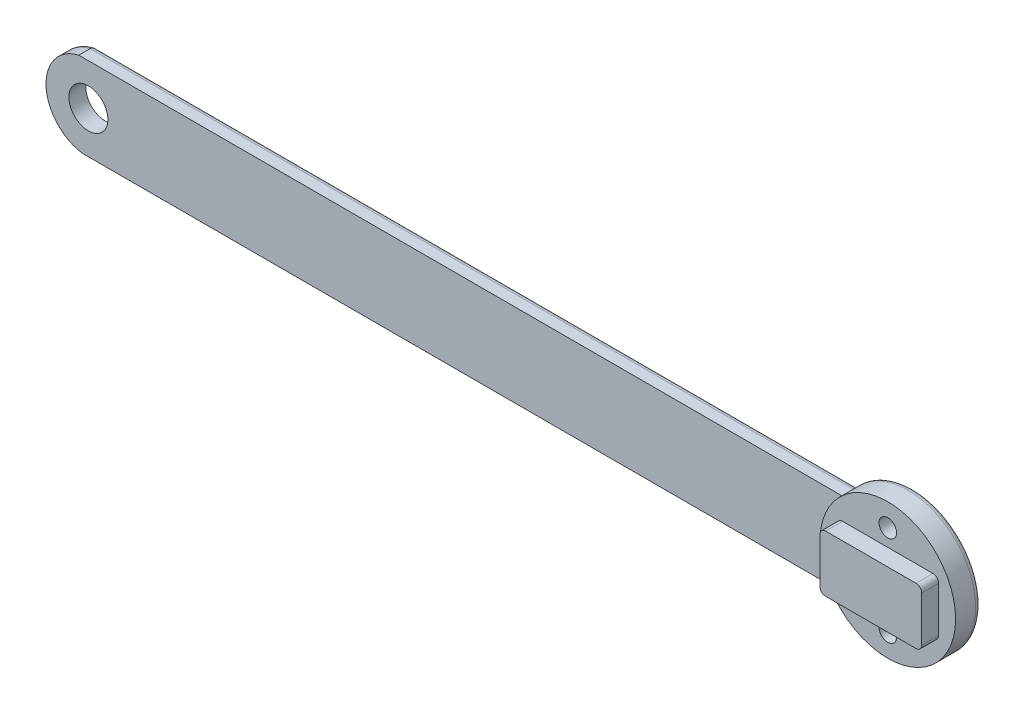
ISO-10303-21;
HEADER;
FILE_DESCRIPTION(('STEP AP214'),'2;1');
FILE_NAME('part.step','',(''),(''),'','','');
FILE_SCHEMA(('AUTOMOTIVE_DESIGN { 1 0 10303 214 1 1 1 1 }'));
ENDSEC;
DATA;
#1=APPLICATION_CONTEXT('core data for automotive mechanical design processes');
#2=APPLICATION_PROTOCOL_DEFINITION('international standard','automotive_design',2000,#1);
#3=PRODUCT_CONTEXT('',#1,'mechanical');
#4=PRODUCT('Part','Part','',(#3));
#5=PRODUCT_RELATED_PRODUCT_CATEGORY('part','',(#4));
#6=PRODUCT_DEFINITION_FORMATION('','',#4);
#7=PRODUCT_DEFINITION_CONTEXT('part definition',#1,'design');
#8=PRODUCT_DEFINITION('design','',#6,#7);
#9=PRODUCT_DEFINITION_SHAPE('','',#8);
#10=(LENGTH_UNIT() NAMED_UNIT(*) SI_UNIT(.MILLI.,.METRE.));
#11=(NAMED_UNIT(*) PLANE_ANGLE_UNIT() SI_UNIT($,.RADIAN.));
#12=(NAMED_UNIT(*) SI_UNIT($,.STERADIAN.) SOLID_ANGLE_UNIT());
#13=UNCERTAINTY_MEASURE_WITH_UNIT(LENGTH_MEASURE(1.E-05),#10,'distance_accuracy_value','');
#14=(GEOMETRIC_REPRESENTATION_CONTEXT(3) GLOBAL_UNCERTAINTY_ASSIGNED_CONTEXT((#13)) GLOBAL_UNIT_ASSIGNED_CONTEXT((#10,
#11,#12)) REPRESENTATION_CONTEXT('',''));
#15=CARTESIAN_POINT('',(0.,0.,0.));
#16=DIRECTION('',(0.,0.,1.));
#17=DIRECTION('',(1.,0.,0.));
#18=AXIS2_PLACEMENT_3D('',#15,#16,#17);
#19=CARTESIAN_POINT('',(0.,0.,3.));
#20=DIRECTION('',(0.,0.,1.));
#21=DIRECTION('',(1.,0.,0.));
#22=AXIS2_PLACEMENT_3D('',#19,#20,#21);
#23=PLANE('',#22);
#24=CARTESIAN_POINT('',(143.,0.,3.));
#25=DIRECTION('',(0.,0.,1.));
#26=DIRECTION('',(1.,0.,0.));
#27=AXIS2_PLACEMENT_3D('',#24,#25,#26);
#28=CIRCLE('',#27,12.);
#29=CARTESIAN_POINT('',(133.479823335982,7.30521979723319,3.));
#30=VERTEX_POINT('',#29);
#31=CARTESIAN_POINT('',(133.568113945347,-7.41886281393917,3.));
#32=VERTEX_POINT('',#31);
#33=EDGE_CURVE('E171',#30,#32,#28,.T.);
#34=ORIENTED_EDGE('',*,*,#33,.F.);
#35=DIRECTION('',(-1.,0.,0.));
#36=VECTOR('',#35,1.);
#37=CARTESIAN_POINT('',(-1.69816480770045,7.30521979723319,3.));
#38=LINE('',#37,#36);
#39=CARTESIAN_POINT('',(-1.69816480770045,7.30521979723319,3.));
#40=VERTEX_POINT('',#39);
#41=EDGE_CURVE('E200',#30,#40,#38,.T.);
#42=ORIENTED_EDGE('',*,*,#41,.T.);
#43=CARTESIAN_POINT('',(0.,0.,3.));
#44=DIRECTION('',(0.,0.,1.));
#45=DIRECTION('',(1.,0.,0.));
#46=AXIS2_PLACEMENT_3D('',#43,#44,#45);
#47=CIRCLE('',#46,7.5);
#48=CARTESIAN_POINT('',(-1.10021568246889,-7.41886281393917,3.));
#49=VERTEX_POINT('',#48);
#50=EDGE_CURVE('E190',#40,#49,#47,.T.);
#51=ORIENTED_EDGE('',*,*,#50,.T.);
#52=DIRECTION('',(1.,0.,0.));
#53=VECTOR('',#52,1.);
#54=CARTESIAN_POINT('',(-1.10021568246889,-7.41886281393917,3.));
#55=LINE('',#54,#53);
#56=EDGE_CURVE('E197',#49,#32,#55,.T.);
#57=ORIENTED_EDGE('',*,*,#56,.T.);
#58=EDGE_LOOP('',(#34,#42,#51,#57));
#59=FACE_BOUND('',#58,.T.);
#60=CARTESIAN_POINT('',(0.,0.,3.));
#61=DIRECTION('',(0.,0.,1.));
#62=DIRECTION('',(1.,0.,0.));
#63=AXIS2_PLACEMENT_3D('',#60,#61,#62);
#64=CIRCLE('',#63,3.45);
#65=CARTESIAN_POINT('',(3.45,0.,3.));
#66=VERTEX_POINT('',#65);
#67=EDGE_CURVE('E186',#66,#66,#64,.T.);
#68=ORIENTED_EDGE('',*,*,#67,.F.);
#69=EDGE_LOOP('',(#68));
#70=FACE_BOUND('',#69,.T.);
#71=ADVANCED_FACE('F38',(#59,#70),#23,.T.);
#72=CARTESIAN_POINT('',(0.,0.,0.));
#73=DIRECTION('',(0.,0.,1.));
#74=DIRECTION('',(1.,0.,0.));
#75=AXIS2_PLACEMENT_3D('',#72,#73,#74);
#76=PLANE('',#75);
#77=CARTESIAN_POINT('',(143.,-8.,0.));
#78=DIRECTION('',(0.,0.,1.));
#79=DIRECTION('',(1.,0.,0.));
#80=AXIS2_PLACEMENT_3D('',#77,#78,#79);
#81=CIRCLE('',#80,1.79999999999999);
#82=CARTESIAN_POINT('',(144.8,-8.,0.));
#83=VERTEX_POINT('',#82);
#84=EDGE_CURVE('E292',#83,#83,#81,.T.);
#85=ORIENTED_EDGE('',*,*,#84,.T.);
#86=EDGE_LOOP('',(#85));
#87=FACE_BOUND('',#86,.T.);
#88=CARTESIAN_POINT('',(143.,8.,0.));
#89=DIRECTION('',(0.,0.,1.));
#90=DIRECTION('',(1.,0.,0.));
#91=AXIS2_PLACEMENT_3D('',#88,#89,#90);
#92=CIRCLE('',#91,1.79999999999999);
#93=CARTESIAN_POINT('',(144.8,8.,0.));
#94=VERTEX_POINT('',#93);
#95=EDGE_CURVE('E240',#94,#94,#92,.T.);
#96=ORIENTED_EDGE('',*,*,#95,.T.);
#97=EDGE_LOOP('',(#96));
#98=FACE_BOUND('',#97,.T.);
#99=DIRECTION('',(1.,0.,0.));
#100=VECTOR('',#99,1.);
#101=CARTESIAN_POINT('',(0.,-6.41886281393917,0.));
#102=LINE('',#101,#100);
#103=CARTESIAN_POINT('',(134.06701616615,-6.41886281393907,0.));
#104=VERTEX_POINT('',#103);
#105=CARTESIAN_POINT('',(-1.02381647566323,-6.41886281393917,0.));
#106=VERTEX_POINT('',#105);
#107=EDGE_CURVE('E226',#104,#106,#102,.F.);
#108=ORIENTED_EDGE('',*,*,#107,.T.);
#109=CARTESIAN_POINT('',(0.,0.,0.));
#110=DIRECTION('',(0.,0.,1.));
#111=DIRECTION('',(1.,0.,0.));
#112=AXIS2_PLACEMENT_3D('',#109,#110,#111);
#113=CIRCLE('',#112,6.5);
#114=CARTESIAN_POINT('',(-1.57930469149517,6.30521979723319,0.));
#115=VERTEX_POINT('',#114);
#116=EDGE_CURVE('E229',#106,#115,#113,.F.);
#117=ORIENTED_EDGE('',*,*,#116,.T.);
#118=DIRECTION('',(-1.,0.,0.));
#119=VECTOR('',#118,1.);
#120=CARTESIAN_POINT('',(0.,6.30521979723319,0.));
#121=LINE('',#120,#119);
#122=CARTESIAN_POINT('',(133.986443359662,6.30521979723309,0.));
#123=VERTEX_POINT('',#122);
#124=EDGE_CURVE('E223',#115,#123,#121,.F.);
#125=ORIENTED_EDGE('',*,*,#124,.T.);
#126=CARTESIAN_POINT('',(143.,0.,0.));
#127=DIRECTION('',(0.,0.,1.));
#128=DIRECTION('',(1.,0.,0.));
#129=AXIS2_PLACEMENT_3D('',#126,#127,#128);
#130=CIRCLE('',#129,11.);
#131=EDGE_CURVE('E220',#123,#104,#130,.F.);
#132=ORIENTED_EDGE('',*,*,#131,.T.);
#133=EDGE_LOOP('',(#108,#117,#125,#132));
#134=FACE_BOUND('',#133,.T.);
#135=CARTESIAN_POINT('',(0.,0.,0.));
#136=DIRECTION('',(0.,0.,1.));
#137=DIRECTION('',(1.,0.,0.));
#138=AXIS2_PLACEMENT_3D('',#135,#136,#137);
#139=CIRCLE('',#138,3.45);
#140=CARTESIAN_POINT('',(3.45,0.,0.));
#141=VERTEX_POINT('',#140);
#142=EDGE_CURVE('E184',#141,#141,#139,.T.);
#143=ORIENTED_EDGE('',*,*,#142,.T.);
#144=EDGE_LOOP('',(#143));
#145=FACE_BOUND('',#144,.T.);
#146=ADVANCED_FACE('F307',(#87,#98,#134,#145),#76,.F.);
#147=CARTESIAN_POINT('',(0.,0.,3.));
#148=DIRECTION('',(0.,0.,-1.));
#149=DIRECTION('',(-1.,0.,0.));
#150=AXIS2_PLACEMENT_3D('',#147,#148,#149);
#151=CYLINDRICAL_SURFACE('',#150,7.5);
#152=DIRECTION('',(0.,0.,-1.));
#153=VECTOR('',#152,1.);
#154=CARTESIAN_POINT('',(-1.69816480770045,7.30521979723319,3.));
#155=LINE('',#154,#153);
#156=CARTESIAN_POINT('',(-1.69816480770045,7.30521979723319,1.));
#157=VERTEX_POINT('',#156);
#158=EDGE_CURVE('E203',#40,#157,#155,.T.);
#159=ORIENTED_EDGE('',*,*,#158,.T.);
#160=CARTESIAN_POINT('',(0.,0.,1.));
#161=DIRECTION('',(0.,0.,1.));
#162=DIRECTION('',(1.,0.,0.));
#163=AXIS2_PLACEMENT_3D('',#160,#161,#162);
#164=CIRCLE('',#163,7.5);
#165=CARTESIAN_POINT('',(-1.10021568246889,-7.41886281393917,1.));
#166=VERTEX_POINT('',#165);
#167=EDGE_CURVE('E216',#157,#166,#164,.T.);
#168=ORIENTED_EDGE('',*,*,#167,.T.);
#169=DIRECTION('',(0.,0.,-1.));
#170=VECTOR('',#169,1.);
#171=CARTESIAN_POINT('',(-1.10021568246889,-7.41886281393917,3.));
#172=LINE('',#171,#170);
#173=EDGE_CURVE('E213',#49,#166,#172,.T.);
#174=ORIENTED_EDGE('',*,*,#173,.F.);
#175=ORIENTED_EDGE('',*,*,#50,.F.);
#176=EDGE_LOOP('',(#159,#168,#174,#175));
#177=FACE_BOUND('',#176,.T.);
#178=ADVANCED_FACE('F310',(#177),#151,.T.);
#179=CARTESIAN_POINT('',(-1.10021568246889,-7.41886281393917,3.));
#180=DIRECTION('',(0.,1.,0.));
#181=DIRECTION('',(-1.,0.,0.));
#182=AXIS2_PLACEMENT_3D('',#179,#180,#181);
#183=PLANE('',#182);
#184=ORIENTED_EDGE('',*,*,#173,.T.);
#185=DIRECTION('',(1.,0.,0.));
#186=VECTOR('',#185,1.);
#187=CARTESIAN_POINT('',(-1.10021568246889,-7.41886281393917,1.));
#188=LINE('',#187,#186);
#189=CARTESIAN_POINT('',(133.568113945347,-7.41886281393917,1.));
#190=VERTEX_POINT('',#189);
#191=EDGE_CURVE('E62',#166,#190,#188,.T.);
#192=ORIENTED_EDGE('',*,*,#191,.T.);
#193=DIRECTION('',(0.,0.,-1.));
#194=VECTOR('',#193,1.);
#195=CARTESIAN_POINT('',(133.568113945347,-7.41886281393917,3.));
#196=LINE('',#195,#194);
#197=EDGE_CURVE('E210',#32,#190,#196,.T.);
#198=ORIENTED_EDGE('',*,*,#197,.F.);
#199=ORIENTED_EDGE('',*,*,#56,.F.);
#200=EDGE_LOOP('',(#184,#192,#198,#199));
#201=FACE_BOUND('',#200,.T.);
#202=ADVANCED_FACE('F345',(#201),#183,.F.);
#203=CARTESIAN_POINT('',(143.,0.,3.));
#204=DIRECTION('',(0.,0.,-1.));
#205=DIRECTION('',(-1.,0.,0.));
#206=AXIS2_PLACEMENT_3D('',#203,#204,#205);
#207=CYLINDRICAL_SURFACE('',#206,12.);
#208=ORIENTED_EDGE('',*,*,#197,.T.);
#209=CARTESIAN_POINT('',(143.,0.,1.));
#210=DIRECTION('',(0.,0.,1.));
#211=DIRECTION('',(1.,0.,0.));
#212=AXIS2_PLACEMENT_3D('',#209,#210,#211);
#213=CIRCLE('',#212,12.);
#214=CARTESIAN_POINT('',(133.479823335982,7.30521979723319,1.));
#215=VERTEX_POINT('',#214);
#216=EDGE_CURVE('E54',#190,#215,#213,.T.);
#217=ORIENTED_EDGE('',*,*,#216,.T.);
#218=DIRECTION('',(0.,0.,-1.));
#219=VECTOR('',#218,1.);
#220=CARTESIAN_POINT('',(133.479823335982,7.30521979723319,3.));
#221=LINE('',#220,#219);
#222=EDGE_CURVE('E207',#30,#215,#221,.T.);
#223=ORIENTED_EDGE('',*,*,#222,.F.);
#224=ORIENTED_EDGE('',*,*,#33,.T.);
#225=EDGE_LOOP('',(#208,#217,#223,#224));
#226=FACE_BOUND('',#225,.T.);
#227=CARTESIAN_POINT('',(143.,0.,4.55));
#228=DIRECTION('',(0.,0.,1.));
#229=DIRECTION('',(1.,0.,0.));
#230=AXIS2_PLACEMENT_3D('',#227,#228,#229);
#231=CIRCLE('',#230,12.);
#232=CARTESIAN_POINT('',(155.,0.,4.55));
#233=VERTEX_POINT('',#232);
#234=EDGE_CURVE('E176',#233,#233,#231,.T.);
#235=ORIENTED_EDGE('',*,*,#234,.F.);
#236=EDGE_LOOP('',(#235));
#237=FACE_BOUND('',#236,.T.);
#238=ADVANCED_FACE('F331',(#226,#237),#207,.T.);
#239=CARTESIAN_POINT('',(-1.69816480770045,7.30521979723319,3.));
#240=DIRECTION('',(0.,-1.,0.));
#241=DIRECTION('',(1.,0.,0.));
#242=AXIS2_PLACEMENT_3D('',#239,#240,#241);
#243=PLANE('',#242);
#244=ORIENTED_EDGE('',*,*,#222,.T.);
#245=DIRECTION('',(-1.,0.,0.));
#246=VECTOR('',#245,1.);
#247=CARTESIAN_POINT('',(-1.69816480770045,7.30521979723319,1.));
#248=LINE('',#247,#246);
#249=EDGE_CURVE('E235',#215,#157,#248,.T.);
#250=ORIENTED_EDGE('',*,*,#249,.T.);
#251=ORIENTED_EDGE('',*,*,#158,.F.);
#252=ORIENTED_EDGE('',*,*,#41,.F.);
#253=EDGE_LOOP('',(#244,#250,#251,#252));
#254=FACE_BOUND('',#253,.T.);
#255=ADVANCED_FACE('F322',(#254),#243,.F.);
#256=CARTESIAN_POINT('',(0.,0.,3.));
#257=DIRECTION('',(0.,0.,-1.));
#258=DIRECTION('',(-1.,0.,0.));
#259=AXIS2_PLACEMENT_3D('',#256,#257,#258);
#260=CYLINDRICAL_SURFACE('',#259,3.45);
#261=ORIENTED_EDGE('',*,*,#67,.T.);
#262=EDGE_LOOP('',(#261));
#263=FACE_BOUND('',#262,.T.);
#264=ORIENTED_EDGE('',*,*,#142,.F.);
#265=EDGE_LOOP('',(#264));
#266=FACE_BOUND('',#265,.T.);
#267=ADVANCED_FACE('F319',(#263,#266),#260,.F.);
#268=CARTESIAN_POINT('',(143.,0.,4.55));
#269=DIRECTION('',(0.,0.,1.));
#270=DIRECTION('',(1.,0.,0.));
#271=AXIS2_PLACEMENT_3D('',#268,#269,#270);
#272=PLANE('',#271);
#273=CARTESIAN_POINT('',(143.,8.,4.55));
#274=DIRECTION('',(0.,0.,1.));
#275=DIRECTION('',(1.,0.,0.));
#276=AXIS2_PLACEMENT_3D('',#273,#274,#275);
#277=CIRCLE('',#276,1.54999999999999);
#278=CARTESIAN_POINT('',(144.55,8.,4.55));
#279=VERTEX_POINT('',#278);
#280=EDGE_CURVE('E251',#279,#279,#277,.T.);
#281=ORIENTED_EDGE('',*,*,#280,.F.);
#282=EDGE_LOOP('',(#281));
#283=FACE_BOUND('',#282,.T.);
#284=CARTESIAN_POINT('',(143.,-8.,4.55));
#285=DIRECTION('',(0.,0.,1.));
#286=DIRECTION('',(-1.,0.,0.));
#287=AXIS2_PLACEMENT_3D('',#284,#285,#286);
#288=CIRCLE('',#287,1.54999999999999);
#289=CARTESIAN_POINT('',(141.45,-8.,4.55));
#290=VERTEX_POINT('',#289);
#291=EDGE_CURVE('E370',#290,#290,#288,.T.);
#292=ORIENTED_EDGE('',*,*,#291,.F.);
#293=EDGE_LOOP('',(#292));
#294=FACE_BOUND('',#293,.T.);
#295=CARTESIAN_POINT('',(151.,4.,4.55));
#296=DIRECTION('',(0.,0.,1.));
#297=DIRECTION('',(-1.,0.,0.));
#298=AXIS2_PLACEMENT_3D('',#295,#296,#297);
#299=CIRCLE('',#298,1.);
#300=CARTESIAN_POINT('',(152.,4.,4.55));
#301=VERTEX_POINT('',#300);
#302=CARTESIAN_POINT('',(151.,5.,4.55));
#303=VERTEX_POINT('',#302);
#304=EDGE_CURVE('E169',#301,#303,#299,.T.);
#305=ORIENTED_EDGE('',*,*,#304,.F.);
#306=DIRECTION('',(0.,1.,0.));
#307=VECTOR('',#306,1.);
#308=CARTESIAN_POINT('',(152.,-4.,4.55));
#309=LINE('',#308,#307);
#310=CARTESIAN_POINT('',(152.,-4.,4.55));
#311=VERTEX_POINT('',#310);
#312=EDGE_CURVE('E166',#311,#301,#309,.T.);
#313=ORIENTED_EDGE('',*,*,#312,.F.);
#314=CARTESIAN_POINT('',(151.,-4.,4.55));
#315=DIRECTION('',(0.,0.,1.));
#316=DIRECTION('',(-1.,0.,0.));
#317=AXIS2_PLACEMENT_3D('',#314,#315,#316);
#318=CIRCLE('',#317,1.);
#319=CARTESIAN_POINT('',(151.,-5.,4.55));
#320=VERTEX_POINT('',#319);
#321=EDGE_CURVE('E413',#320,#311,#318,.T.);
#322=ORIENTED_EDGE('',*,*,#321,.F.);
#323=DIRECTION('',(1.,0.,0.));
#324=VECTOR('',#323,1.);
#325=CARTESIAN_POINT('',(135.,-5.,4.55));
#326=LINE('',#325,#324);
#327=CARTESIAN_POINT('',(135.,-5.,4.55));
#328=VERTEX_POINT('',#327);
#329=EDGE_CURVE('E409',#328,#320,#326,.T.);
#330=ORIENTED_EDGE('',*,*,#329,.F.);
#331=CARTESIAN_POINT('',(135.,-4.,4.55));
#332=DIRECTION('',(0.,0.,1.));
#333=DIRECTION('',(-1.,0.,0.));
#334=AXIS2_PLACEMENT_3D('',#331,#332,#333);
#335=CIRCLE('',#334,1.);
#336=CARTESIAN_POINT('',(134.,-4.,4.55));
#337=VERTEX_POINT('',#336);
#338=EDGE_CURVE('E405',#337,#328,#335,.T.);
#339=ORIENTED_EDGE('',*,*,#338,.F.);
#340=DIRECTION('',(0.,-1.,0.));
#341=VECTOR('',#340,1.);
#342=CARTESIAN_POINT('',(134.,-4.,4.55));
#343=LINE('',#342,#341);
#344=CARTESIAN_POINT('',(134.,4.,4.55));
#345=VERTEX_POINT('',#344);
#346=EDGE_CURVE('E401',#345,#337,#343,.T.);
#347=ORIENTED_EDGE('',*,*,#346,.F.);
#348=CARTESIAN_POINT('',(135.,4.,4.55));
#349=DIRECTION('',(0.,0.,1.));
#350=DIRECTION('',(-1.,0.,0.));
#351=AXIS2_PLACEMENT_3D('',#348,#349,#350);
#352=CIRCLE('',#351,1.);
#353=CARTESIAN_POINT('',(135.,5.,4.55));
#354=VERTEX_POINT('',#353);
#355=EDGE_CURVE('E397',#354,#345,#352,.T.);
#356=ORIENTED_EDGE('',*,*,#355,.F.);
#357=DIRECTION('',(-1.,0.,0.));
#358=VECTOR('',#357,1.);
#359=CARTESIAN_POINT('',(135.,5.,4.55));
#360=LINE('',#359,#358);
#361=EDGE_CURVE('E394',#303,#354,#360,.T.);
#362=ORIENTED_EDGE('',*,*,#361,.F.);
#363=EDGE_LOOP('',(#305,#313,#322,#330,#339,#347,#356,#362));
#364=FACE_BOUND('',#363,.T.);
#365=ORIENTED_EDGE('',*,*,#234,.T.);
#366=EDGE_LOOP('',(#365));
#367=FACE_BOUND('',#366,.T.);
#368=ADVANCED_FACE('F321',(#283,#294,#364,#367),#272,.T.);
#369=CARTESIAN_POINT('',(151.,4.,7.55));
#370=DIRECTION('',(0.,0.,-1.));
#371=DIRECTION('',(-1.,0.,0.));
#372=AXIS2_PLACEMENT_3D('',#369,#370,#371);
#373=CYLINDRICAL_SURFACE('',#372,1.);
#374=ORIENTED_EDGE('',*,*,#304,.T.);
#375=DIRECTION('',(0.,0.,-1.));
#376=VECTOR('',#375,1.);
#377=CARTESIAN_POINT('',(151.,5.,7.55));
#378=LINE('',#377,#376);
#379=CARTESIAN_POINT('',(151.,5.,7.55));
#380=VERTEX_POINT('',#379);
#381=EDGE_CURVE('E148',#380,#303,#378,.T.);
#382=ORIENTED_EDGE('',*,*,#381,.F.);
#383=CARTESIAN_POINT('',(151.,4.,7.55));
#384=DIRECTION('',(0.,0.,1.));
#385=DIRECTION('',(-1.,0.,0.));
#386=AXIS2_PLACEMENT_3D('',#383,#384,#385);
#387=CIRCLE('',#386,1.);
#388=CARTESIAN_POINT('',(152.,4.,7.55));
#389=VERTEX_POINT('',#388);
#390=EDGE_CURVE('E156',#389,#380,#387,.T.);
#391=ORIENTED_EDGE('',*,*,#390,.F.);
#392=DIRECTION('',(0.,0.,-1.));
#393=VECTOR('',#392,1.);
#394=CARTESIAN_POINT('',(152.,4.,7.55));
#395=LINE('',#394,#393);
#396=EDGE_CURVE('E392',#389,#301,#395,.T.);
#397=ORIENTED_EDGE('',*,*,#396,.T.);
#398=EDGE_LOOP('',(#374,#382,#391,#397));
#399=FACE_BOUND('',#398,.T.);
#400=ADVANCED_FACE('F168',(#399),#373,.T.);
#401=CARTESIAN_POINT('',(135.,5.,7.55));
#402=DIRECTION('',(0.,-1.,0.));
#403=DIRECTION('',(0.,0.,-1.));
#404=AXIS2_PLACEMENT_3D('',#401,#402,#403);
#405=PLANE('',#404);
#406=ORIENTED_EDGE('',*,*,#361,.T.);
#407=DIRECTION('',(0.,0.,-1.));
#408=VECTOR('',#407,1.);
#409=CARTESIAN_POINT('',(135.,5.,7.55));
#410=LINE('',#409,#408);
#411=CARTESIAN_POINT('',(135.,5.,7.55));
#412=VERTEX_POINT('',#411);
#413=EDGE_CURVE('E151',#412,#354,#410,.T.);
#414=ORIENTED_EDGE('',*,*,#413,.F.);
#415=DIRECTION('',(-1.,0.,0.));
#416=VECTOR('',#415,1.);
#417=CARTESIAN_POINT('',(135.,5.,7.55));
#418=LINE('',#417,#416);
#419=EDGE_CURVE('E143',#380,#412,#418,.T.);
#420=ORIENTED_EDGE('',*,*,#419,.F.);
#421=ORIENTED_EDGE('',*,*,#381,.T.);
#422=EDGE_LOOP('',(#406,#414,#420,#421));
#423=FACE_BOUND('',#422,.T.);
#424=ADVANCED_FACE('F146',(#423),#405,.F.);
#425=CARTESIAN_POINT('',(135.,4.,7.55));
#426=DIRECTION('',(0.,0.,-1.));
#427=DIRECTION('',(-1.,0.,0.));
#428=AXIS2_PLACEMENT_3D('',#425,#426,#427);
#429=CYLINDRICAL_SURFACE('',#428,1.);
#430=ORIENTED_EDGE('',*,*,#355,.T.);
#431=DIRECTION('',(0.,0.,-1.));
#432=VECTOR('',#431,1.);
#433=CARTESIAN_POINT('',(134.,4.,7.55));
#434=LINE('',#433,#432);
#435=CARTESIAN_POINT('',(134.,4.,7.55));
#436=VERTEX_POINT('',#435);
#437=EDGE_CURVE('E178',#436,#345,#434,.T.);
#438=ORIENTED_EDGE('',*,*,#437,.F.);
#439=CARTESIAN_POINT('',(135.,4.,7.55));
#440=DIRECTION('',(0.,0.,1.));
#441=DIRECTION('',(-1.,0.,0.));
#442=AXIS2_PLACEMENT_3D('',#439,#440,#441);
#443=CIRCLE('',#442,1.);
#444=EDGE_CURVE('E155',#412,#436,#443,.T.);
#445=ORIENTED_EDGE('',*,*,#444,.F.);
#446=ORIENTED_EDGE('',*,*,#413,.T.);
#447=EDGE_LOOP('',(#430,#438,#445,#446));
#448=FACE_BOUND('',#447,.T.);
#449=ADVANCED_FACE('F445',(#448),#429,.T.);
#450=CARTESIAN_POINT('',(134.,-4.,7.55));
#451=DIRECTION('',(1.,0.,0.));
#452=DIRECTION('',(0.,0.,-1.));
#453=AXIS2_PLACEMENT_3D('',#450,#451,#452);
#454=PLANE('',#453);
#455=ORIENTED_EDGE('',*,*,#346,.T.);
#456=DIRECTION('',(0.,0.,-1.));
#457=VECTOR('',#456,1.);
#458=CARTESIAN_POINT('',(134.,-4.,7.55));
#459=LINE('',#458,#457);
#460=CARTESIAN_POINT('',(134.,-4.,7.55));
#461=VERTEX_POINT('',#460);
#462=EDGE_CURVE('E434',#461,#337,#459,.T.);
#463=ORIENTED_EDGE('',*,*,#462,.F.);
#464=DIRECTION('',(0.,-1.,0.));
#465=VECTOR('',#464,1.);
#466=CARTESIAN_POINT('',(134.,-4.,7.55));
#467=LINE('',#466,#465);
#468=EDGE_CURVE('E378',#436,#461,#467,.T.);
#469=ORIENTED_EDGE('',*,*,#468,.F.);
#470=ORIENTED_EDGE('',*,*,#437,.T.);
#471=EDGE_LOOP('',(#455,#463,#469,#470));
#472=FACE_BOUND('',#471,.T.);
#473=ADVANCED_FACE('F442',(#472),#454,.F.);
#474=CARTESIAN_POINT('',(135.,-4.,7.55));
#475=DIRECTION('',(0.,0.,-1.));
#476=DIRECTION('',(-1.,0.,0.));
#477=AXIS2_PLACEMENT_3D('',#474,#475,#476);
#478=CYLINDRICAL_SURFACE('',#477,1.);
#479=ORIENTED_EDGE('',*,*,#338,.T.);
#480=DIRECTION('',(0.,0.,-1.));
#481=VECTOR('',#480,1.);
#482=CARTESIAN_POINT('',(135.,-5.,7.55));
#483=LINE('',#482,#481);
#484=CARTESIAN_POINT('',(135.,-5.,7.55));
#485=VERTEX_POINT('',#484);
#486=EDGE_CURVE('E430',#485,#328,#483,.T.);
#487=ORIENTED_EDGE('',*,*,#486,.F.);
#488=CARTESIAN_POINT('',(135.,-4.,7.55));
#489=DIRECTION('',(0.,0.,1.));
#490=DIRECTION('',(-1.,0.,0.));
#491=AXIS2_PLACEMENT_3D('',#488,#489,#490);
#492=CIRCLE('',#491,1.);
#493=EDGE_CURVE('E381',#461,#485,#492,.T.);
#494=ORIENTED_EDGE('',*,*,#493,.F.);
#495=ORIENTED_EDGE('',*,*,#462,.T.);
#496=EDGE_LOOP('',(#479,#487,#494,#495));
#497=FACE_BOUND('',#496,.T.);
#498=ADVANCED_FACE('F450',(#497),#478,.T.);
#499=CARTESIAN_POINT('',(135.,-5.,7.55));
#500=DIRECTION('',(0.,1.,0.));
#501=DIRECTION('',(0.,0.,1.));
#502=AXIS2_PLACEMENT_3D('',#499,#500,#501);
#503=PLANE('',#502);
#504=ORIENTED_EDGE('',*,*,#329,.T.);
#505=DIRECTION('',(0.,0.,-1.));
#506=VECTOR('',#505,1.);
#507=CARTESIAN_POINT('',(151.,-5.,7.55));
#508=LINE('',#507,#506);
#509=CARTESIAN_POINT('',(151.,-5.,7.55));
#510=VERTEX_POINT('',#509);
#511=EDGE_CURVE('E426',#510,#320,#508,.T.);
#512=ORIENTED_EDGE('',*,*,#511,.F.);
#513=DIRECTION('',(1.,0.,0.));
#514=VECTOR('',#513,1.);
#515=CARTESIAN_POINT('',(135.,-5.,7.55));
#516=LINE('',#515,#514);
#517=EDGE_CURVE('E384',#485,#510,#516,.T.);
#518=ORIENTED_EDGE('',*,*,#517,.F.);
#519=ORIENTED_EDGE('',*,*,#486,.T.);
#520=EDGE_LOOP('',(#504,#512,#518,#519));
#521=FACE_BOUND('',#520,.T.);
#522=ADVANCED_FACE('F454',(#521),#503,.F.);
#523=CARTESIAN_POINT('',(151.,-4.,7.55));
#524=DIRECTION('',(0.,0.,-1.));
#525=DIRECTION('',(-1.,0.,0.));
#526=AXIS2_PLACEMENT_3D('',#523,#524,#525);
#527=CYLINDRICAL_SURFACE('',#526,1.);
#528=ORIENTED_EDGE('',*,*,#321,.T.);
#529=DIRECTION('',(0.,0.,-1.));
#530=VECTOR('',#529,1.);
#531=CARTESIAN_POINT('',(152.,-4.,7.55));
#532=LINE('',#531,#530);
#533=CARTESIAN_POINT('',(152.,-4.,7.55));
#534=VERTEX_POINT('',#533);
#535=EDGE_CURVE('E422',#534,#311,#532,.T.);
#536=ORIENTED_EDGE('',*,*,#535,.F.);
#537=CARTESIAN_POINT('',(151.,-4.,7.55));
#538=DIRECTION('',(0.,0.,1.));
#539=DIRECTION('',(-1.,0.,0.));
#540=AXIS2_PLACEMENT_3D('',#537,#538,#539);
#541=CIRCLE('',#540,1.);
#542=EDGE_CURVE('E387',#510,#534,#541,.T.);
#543=ORIENTED_EDGE('',*,*,#542,.F.);
#544=ORIENTED_EDGE('',*,*,#511,.T.);
#545=EDGE_LOOP('',(#528,#536,#543,#544));
#546=FACE_BOUND('',#545,.T.);
#547=ADVANCED_FACE('F459',(#546),#527,.T.);
#548=CARTESIAN_POINT('',(152.,-4.,7.55));
#549=DIRECTION('',(-1.,0.,0.));
#550=DIRECTION('',(0.,0.,1.));
#551=AXIS2_PLACEMENT_3D('',#548,#549,#550);
#552=PLANE('',#551);
#553=ORIENTED_EDGE('',*,*,#312,.T.);
#554=ORIENTED_EDGE('',*,*,#396,.F.);
#555=DIRECTION('',(0.,1.,0.));
#556=VECTOR('',#555,1.);
#557=CARTESIAN_POINT('',(152.,-4.,7.55));
#558=LINE('',#557,#556);
#559=EDGE_CURVE('E161',#534,#389,#558,.T.);
#560=ORIENTED_EDGE('',*,*,#559,.F.);
#561=ORIENTED_EDGE('',*,*,#535,.T.);
#562=EDGE_LOOP('',(#553,#554,#560,#561));
#563=FACE_BOUND('',#562,.T.);
#564=ADVANCED_FACE('F461',(#563),#552,.F.);
#565=CARTESIAN_POINT('',(151.,4.,7.55));
#566=DIRECTION('',(0.,0.,-1.));
#567=DIRECTION('',(-1.,0.,0.));
#568=AXIS2_PLACEMENT_3D('',#565,#566,#567);
#569=PLANE('',#568);
#570=ORIENTED_EDGE('',*,*,#390,.T.);
#571=ORIENTED_EDGE('',*,*,#419,.T.);
#572=ORIENTED_EDGE('',*,*,#444,.T.);
#573=ORIENTED_EDGE('',*,*,#468,.T.);
#574=ORIENTED_EDGE('',*,*,#493,.T.);
#575=ORIENTED_EDGE('',*,*,#517,.T.);
#576=ORIENTED_EDGE('',*,*,#542,.T.);
#577=ORIENTED_EDGE('',*,*,#559,.T.);
#578=EDGE_LOOP('',(#570,#571,#572,#573,#574,#575,#576,#577));
#579=FACE_BOUND('',#578,.T.);
#580=ADVANCED_FACE('F159',(#579),#569,.F.);
#581=CARTESIAN_POINT('',(143.,0.,1.));
#582=DIRECTION('',(0.,0.,1.));
#583=DIRECTION('',(1.,0.,0.));
#584=AXIS2_PLACEMENT_3D('',#581,#582,#583);
#585=TOROIDAL_SURFACE('',#584,11.,1.);
#586=CARTESIAN_POINT('',(133.568113945347,-7.41886281393917,1.));
#587=CARTESIAN_POINT('',(133.568113517239,-7.41886395801711,0.973921496094497));
#588=CARTESIAN_POINT('',(133.568609781046,-7.41784193413652,0.947856263391549));
#589=CARTESIAN_POINT('',(133.570586091814,-7.41377353672944,0.895928199667986));
#590=CARTESIAN_POINT('',(133.572065895017,-7.41072766479246,0.870065320102789));
#591=CARTESIAN_POINT('',(133.577950107641,-7.39862039069378,0.793239662406042));
#592=CARTESIAN_POINT('',(133.583799509471,-7.38658890544588,0.742818533203566));
#593=CARTESIAN_POINT('',(133.599113529824,-7.35513782333288,0.644988847209586));
#594=CARTESIAN_POINT('',(133.608576418789,-7.33572176103601,0.597578861807959));
#595=CARTESIAN_POINT('',(133.630766802904,-7.29028484923833,0.506848065193938));
#596=CARTESIAN_POINT('',(133.643496065001,-7.26426042502048,0.463529484635074));
#597=CARTESIAN_POINT('',(133.672346698471,-7.20542520899832,0.380308591972328));
#598=CARTESIAN_POINT('',(133.688580890668,-7.17238955053542,0.34060508987824));
#599=CARTESIAN_POINT('',(133.723614067827,-7.10131662587755,0.267288640673735));
#600=CARTESIAN_POINT('',(133.742413784953,-7.06327793199783,0.233677438620206));
#601=CARTESIAN_POINT('',(133.783973290225,-6.97947438897634,0.170097818456681));
#602=CARTESIAN_POINT('',(133.806939674808,-6.93331878117255,0.140780293708601));
#603=CARTESIAN_POINT('',(133.854751076068,-6.83762411998935,0.0902919169413956));
#604=CARTESIAN_POINT('',(133.879597440133,-6.78808264245534,0.0691269753541924));
#605=CARTESIAN_POINT('',(133.930636063816,-6.68675578066444,0.035065198685349));
#606=CARTESIAN_POINT('',(133.956831482286,-6.63496517896826,0.0221888196498998));
#607=CARTESIAN_POINT('',(134.009933176871,-6.53045070924563,0.0048390270153667));
#608=CARTESIAN_POINT('',(134.036837886018,-6.47772897153687,0.000348445300780173));
#609=CARTESIAN_POINT('',(134.064881293709,-6.42302607639487,6.48685437392321E-06));
#610=CARTESIAN_POINT('',(134.065948683621,-6.42094434716938,-1.32394171531592E-08));
#611=CARTESIAN_POINT('',(134.06701616615,-6.41886281393917,0.));
#612=B_SPLINE_CURVE_WITH_KNOTS('',3,(#586,#587,#588,#589,#590,#591,#592,#593,#594,#595,#596,
#597,#598,#599,#600,#601,#602,#603,#604,#605,#606,#607,#608,#609,#610,#611),.UNSPECIFIED.,.F.,
.F.,(4,2,2,2,2,2,2,2,2,2,2,2,4),(0.,0.0781848043726155,0.156350238685721,0.312026010652422,
0.467627363249305,0.623313066577169,0.785063361401478,0.946859914444024,1.12405113061603,
1.30137056557537,1.47912596113717,1.65651704010943,1.66353530477639),.UNSPECIFIED.);
#613=EDGE_CURVE('E284',#104,#190,#612,.F.);
#614=ORIENTED_EDGE('',*,*,#613,.F.);
#615=ORIENTED_EDGE('',*,*,#131,.F.);
#616=CARTESIAN_POINT('',(133.479823335982,7.30521979723319,1.));
#617=CARTESIAN_POINT('',(133.479822886108,7.30522097164498,0.973974627960922));
#618=CARTESIAN_POINT('',(133.480324711335,7.30420307039036,0.947962524815838));
#619=CARTESIAN_POINT('',(133.482323053956,7.30015132180276,0.896140780656533));
#620=CARTESIAN_POINT('',(133.483819319397,7.29711798510309,0.87033109003429));
#621=CARTESIAN_POINT('',(133.489768455597,7.28506163259289,0.79366767889959));
#622=CARTESIAN_POINT('',(133.49568186361,7.27308183879956,0.743355306539155));
#623=CARTESIAN_POINT('',(133.511160207283,7.24177251738854,0.645740109402412));
#624=CARTESIAN_POINT('',(133.520723302921,7.22244669335852,0.598435782089904));
#625=CARTESIAN_POINT('',(133.543143916486,7.17723062781306,0.507904126754011));
#626=CARTESIAN_POINT('',(133.556003282308,7.1513367042961,0.464679104252411));
#627=CARTESIAN_POINT('',(133.585155506941,7.09278311479829,0.381590887217304));
#628=CARTESIAN_POINT('',(133.601564775226,7.05989494290469,0.341930320063422));
#629=CARTESIAN_POINT('',(133.636970657448,6.98914977840587,0.268675822808049));
#630=CARTESIAN_POINT('',(133.655968002052,6.95129138271234,0.235083612182811));
#631=CARTESIAN_POINT('',(133.698009496238,6.86779575466713,0.171431236045631));
#632=CARTESIAN_POINT('',(133.721267660013,6.82175992617843,0.142036093179986));
#633=CARTESIAN_POINT('',(133.769686794205,6.72631428700145,0.0913735963009332));
#634=CARTESIAN_POINT('',(133.794849189382,6.67690195272156,0.0701124016490048));
#635=CARTESIAN_POINT('',(133.846818400173,6.57529055742244,0.0356453372281408));
#636=CARTESIAN_POINT('',(133.87364259689,6.52306323195566,0.0225500223094892));
#637=CARTESIAN_POINT('',(133.928026513478,6.41765987205894,0.00491028782547983));
#638=CARTESIAN_POINT('',(133.95558461111,6.36448600428958,0.000348376992818919));
#639=CARTESIAN_POINT('',(133.984291849756,6.3093508699138,6.38714324826094E-06));
#640=CARTESIAN_POINT('',(133.985367558443,6.3072852357772,-1.27898276302135E-08));
#641=CARTESIAN_POINT('',(133.986443359662,6.30521979723319,0.));
#642=B_SPLINE_CURVE_WITH_KNOTS('',3,(#616,#617,#618,#619,#620,#621,#622,#623,#624,#625,#626,
#627,#628,#629,#630,#631,#632,#633,#634,#635,#636,#637,#638,#639,#640,#641),.UNSPECIFIED.,.F.,
.F.,(4,2,2,2,2,2,2,2,2,2,2,2,4),(0.,0.0780254281695243,0.156031095250633,0.3113785251373,
0.46664773844384,0.622004187010548,0.783551960399513,0.945145436993409,1.12251530071047,
1.30001921161049,1.47987688486423,1.65936549079618,1.66635231608203),.UNSPECIFIED.);
#643=EDGE_CURVE('E276',#215,#123,#642,.T.);
#644=ORIENTED_EDGE('',*,*,#643,.F.);
#645=ORIENTED_EDGE('',*,*,#216,.F.);
#646=EDGE_LOOP('',(#614,#615,#644,#645));
#647=FACE_BOUND('',#646,.T.);
#648=ADVANCED_FACE('F271',(#647),#585,.T.);
#649=CARTESIAN_POINT('',(-1.69816480770045,6.30521979723319,1.));
#650=DIRECTION('',(-1.,0.,0.));
#651=DIRECTION('',(0.,-1.,0.));
#652=AXIS2_PLACEMENT_3D('',#649,#650,#651);
#653=CYLINDRICAL_SURFACE('',#652,1.);
#654=ORIENTED_EDGE('',*,*,#643,.T.);
#655=ORIENTED_EDGE('',*,*,#124,.F.);
#656=CARTESIAN_POINT('',(-1.69816480770045,7.30521979723319,1.));
#657=CARTESIAN_POINT('',(-1.6981647452114,7.3052197068445,0.972002004055156));
#658=CARTESIAN_POINT('',(-1.69802985946923,7.30404321912147,0.944017465604895));
#659=CARTESIAN_POINT('',(-1.69749148106513,7.29935037891434,0.888249593194003));
#660=CARTESIAN_POINT('',(-1.69708800453889,7.29583416698996,0.860466247248013));
#661=CARTESIAN_POINT('',(-1.69547811336038,7.28181158480146,0.777771414562326));
#662=CARTESIAN_POINT('',(-1.69387222797804,7.26783116295947,0.723415445786186));
#663=CARTESIAN_POINT('',(-1.68963271837315,7.23100939167939,0.617841950565139));
#664=CARTESIAN_POINT('',(-1.68699866646974,7.20816435489872,0.566625740419818));
#665=CARTESIAN_POINT('',(-1.68076621028964,7.15428469733058,0.468769231245532));
#666=CARTESIAN_POINT('',(-1.67716798404104,7.12325158842991,0.422128089631609));
#667=CARTESIAN_POINT('',(-1.66908259403903,7.0537996017727,0.334598756341508));
#668=CARTESIAN_POINT('',(-1.66459305323917,7.01536098255309,0.293726459373029));
#669=CARTESIAN_POINT('',(-1.6548384992174,6.93224299305202,0.218997030434602));
#670=CARTESIAN_POINT('',(-1.64957322799504,6.88756154672284,0.185142241471763));
#671=CARTESIAN_POINT('',(-1.63836233085852,6.7929393167486,0.125192397818146));
#672=CARTESIAN_POINT('',(-1.63241253293046,6.74296644802207,0.0991488389928719));
#673=CARTESIAN_POINT('',(-1.62001164902594,6.63943279159667,0.0558367129176214));
#674=CARTESIAN_POINT('',(-1.61356093843331,6.5858746947406,0.0385616463534906));
#675=CARTESIAN_POINT('',(-1.60270419685692,6.49630521558325,0.0177667412758639));
#676=CARTESIAN_POINT('',(-1.59839393626848,6.46088454662569,0.0115360283583055));
#677=CARTESIAN_POINT('',(-1.5896865493382,6.38962558054419,0.00292471225018944));
#678=CARTESIAN_POINT('',(-1.58528957370121,6.35378804591807,0.000537938763970558));
#679=CARTESIAN_POINT('',(-1.58035145729443,6.31370921800917,2.69656578855572E-05));
#680=CARTESIAN_POINT('',(-1.57982817767684,6.30946428187439,-7.09997535578781E-08));
#681=CARTESIAN_POINT('',(-1.57930469149517,6.30521979723319,0.));
#682=B_SPLINE_CURVE_WITH_KNOTS('',3,(#656,#657,#658,#659,#660,#661,#662,#663,#664,#665,#666,
#667,#668,#669,#670,#671,#672,#673,#674,#675,#676,#677,#678,#679,#680,#681),.UNSPECIFIED.,.F.,
.F.,(4,2,2,2,2,2,2,2,2,2,2,2,4),(0.,0.0839422463225566,0.16787945024091,0.335458613886796,
0.503107558942565,0.670725570090824,0.838796756392774,1.00692396827091,1.17613636238299,
1.34522315036444,1.45371013961697,1.56202281124311,1.57485386676436),.UNSPECIFIED.);
#683=EDGE_CURVE('E250',#157,#115,#682,.T.);
#684=ORIENTED_EDGE('',*,*,#683,.F.);
#685=ORIENTED_EDGE('',*,*,#249,.F.);
#686=EDGE_LOOP('',(#654,#655,#684,#685));
#687=FACE_BOUND('',#686,.T.);
#688=ADVANCED_FACE('F266',(#687),#653,.T.);
#689=CARTESIAN_POINT('',(-1.10021568246889,-6.41886281393917,1.));
#690=DIRECTION('',(1.,0.,0.));
#691=DIRECTION('',(0.,1.,0.));
#692=AXIS2_PLACEMENT_3D('',#689,#690,#691);
#693=CYLINDRICAL_SURFACE('',#692,1.);
#694=ORIENTED_EDGE('',*,*,#613,.T.);
#695=ORIENTED_EDGE('',*,*,#191,.F.);
#696=CARTESIAN_POINT('',(-1.10021568246889,-7.41886281393917,1.));
#697=CARTESIAN_POINT('',(-1.10021563800147,-7.41886266680902,0.971922691542546));
#698=CARTESIAN_POINT('',(-1.10012842562155,-7.41767956538724,0.943858853088849));
#699=CARTESIAN_POINT('',(-1.09978030130966,-7.41295996209267,0.887932381711065));
#700=CARTESIAN_POINT('',(-1.09951939857003,-7.40942358476394,0.860069738217876));
#701=CARTESIAN_POINT('',(-1.09847824532431,-7.39531869115366,0.777132118095799));
#702=CARTESIAN_POINT('',(-1.09743954451465,-7.38125431755043,0.7226133718171));
#703=CARTESIAN_POINT('',(-1.09469656107817,-7.34420008147183,0.616720228826756));
#704=CARTESIAN_POINT('',(-1.09299197775798,-7.32120618670935,0.565347264800347));
#705=CARTESIAN_POINT('',(-1.08895742827326,-7.26695760121452,0.467199248553669));
#706=CARTESIAN_POINT('',(-1.08662759729621,-7.23570469622049,0.42042320539676));
#707=CARTESIAN_POINT('',(-1.08139477377799,-7.16579311440557,0.33273415570298));
#708=CARTESIAN_POINT('',(-1.07849115495214,-7.12712634679821,0.291827640675616));
#709=CARTESIAN_POINT('',(-1.07218102688499,-7.0434965364247,0.21707044914144));
#710=CARTESIAN_POINT('',(-1.06877434702359,-6.99853135773267,0.183222175966887));
#711=CARTESIAN_POINT('',(-1.06153270560374,-6.90346409469037,0.123458664459092));
#712=CARTESIAN_POINT('',(-1.05769654889562,-6.85334770891732,0.0975663542843915));
#713=CARTESIAN_POINT('',(-1.04970173748784,-6.74952287308182,0.0545826754019971));
#714=CARTESIAN_POINT('',(-1.04554336004548,-6.69581751653327,0.0374838349565116));
#715=CARTESIAN_POINT('',(-1.03864117759444,-6.60723700801445,0.0172860632928568));
#716=CARTESIAN_POINT('',(-1.03596157198814,-6.57297739143192,0.0113355200135526));
#717=CARTESIAN_POINT('',(-1.03054997315893,-6.50406286698327,0.00303397111484818));
#718=CARTESIAN_POINT('',(-1.02781806691839,-6.46940864870697,0.000677439243551727));
#719=CARTESIAN_POINT('',(-1.02465552225772,-6.4294534276271,4.19697659686333E-05));
#720=CARTESIAN_POINT('',(-1.02423610325116,-6.42415779623215,-1.11266979688968E-07));
#721=CARTESIAN_POINT('',(-1.02381647565805,-6.41886281393917,0.));
#722=B_SPLINE_CURVE_WITH_KNOTS('',3,(#696,#697,#698,#699,#700,#701,#702,#703,#704,#705,#706,
#707,#708,#709,#710,#711,#712,#713,#714,#715,#716,#717,#718,#719,#720,#721),.UNSPECIFIED.,.F.,
.F.,(4,2,2,2,2,2,2,2,2,2,2,2,4),(0.,0.0841801257498763,0.168355796730524,0.336428495244397,
0.50457717845007,0.672689534758459,0.840986408038927,1.00934049318934,1.17817530064302,
1.34686641255777,1.45133266465438,1.55563812401156,1.57157448774638),.UNSPECIFIED.);
#723=EDGE_CURVE('E241',#106,#166,#722,.F.);
#724=ORIENTED_EDGE('',*,*,#723,.F.);
#725=ORIENTED_EDGE('',*,*,#107,.F.);
#726=EDGE_LOOP('',(#694,#695,#724,#725));
#727=FACE_BOUND('',#726,.T.);
#728=ADVANCED_FACE('F258',(#727),#693,.T.);
#729=CARTESIAN_POINT('',(0.,0.,1.));
#730=DIRECTION('',(0.,0.,1.));
#731=DIRECTION('',(1.,0.,0.));
#732=AXIS2_PLACEMENT_3D('',#729,#730,#731);
#733=TOROIDAL_SURFACE('',#732,6.5,1.);
#734=ORIENTED_EDGE('',*,*,#683,.T.);
#735=ORIENTED_EDGE('',*,*,#116,.F.);
#736=ORIENTED_EDGE('',*,*,#723,.T.);
#737=ORIENTED_EDGE('',*,*,#167,.F.);
#738=EDGE_LOOP('',(#734,#735,#736,#737));
#739=FACE_BOUND('',#738,.T.);
#740=ADVANCED_FACE('F261',(#739),#733,.T.);
#741=CARTESIAN_POINT('',(143.,-8.,0.));
#742=DIRECTION('',(0.,0.,1.));
#743=DIRECTION('',(1.,0.,0.));
#744=AXIS2_PLACEMENT_3D('',#741,#742,#743);
#745=CYLINDRICAL_SURFACE('',#744,1.54999999999999);
#746=CARTESIAN_POINT('',(143.,-8.,0.25));
#747=DIRECTION('',(0.,0.,1.));
#748=DIRECTION('',(1.,0.,0.));
#749=AXIS2_PLACEMENT_3D('',#746,#747,#748);
#750=CIRCLE('',#749,1.54999999999999);
#751=CARTESIAN_POINT('',(144.55,-8.,0.25));
#752=VERTEX_POINT('',#751);
#753=EDGE_CURVE('E47',#752,#752,#750,.F.);
#754=ORIENTED_EDGE('',*,*,#753,.T.);
#755=EDGE_LOOP('',(#754));
#756=FACE_BOUND('',#755,.T.);
#757=ORIENTED_EDGE('',*,*,#291,.T.);
#758=EDGE_LOOP('',(#757));
#759=FACE_BOUND('',#758,.T.);
#760=ADVANCED_FACE('F264',(#756,#759),#745,.F.);
#761=CARTESIAN_POINT('',(143.,8.,0.));
#762=DIRECTION('',(0.,0.,1.));
#763=DIRECTION('',(1.,0.,0.));
#764=AXIS2_PLACEMENT_3D('',#761,#762,#763);
#765=CYLINDRICAL_SURFACE('',#764,1.54999999999999);
#766=CARTESIAN_POINT('',(143.,8.,0.25));
#767=DIRECTION('',(0.,0.,1.));
#768=DIRECTION('',(1.,0.,0.));
#769=AXIS2_PLACEMENT_3D('',#766,#767,#768);
#770=CIRCLE('',#769,1.54999999999999);
#771=CARTESIAN_POINT('',(144.55,8.,0.25));
#772=VERTEX_POINT('',#771);
#773=EDGE_CURVE('E11',#772,#772,#770,.F.);
#774=ORIENTED_EDGE('',*,*,#773,.T.);
#775=EDGE_LOOP('',(#774));
#776=FACE_BOUND('',#775,.T.);
#777=ORIENTED_EDGE('',*,*,#280,.T.);
#778=EDGE_LOOP('',(#777));
#779=FACE_BOUND('',#778,.T.);
#780=ADVANCED_FACE('F304',(#776,#779),#765,.F.);
#781=CARTESIAN_POINT('',(143.,-8.,0.25));
#782=DIRECTION('',(0.,0.,1.));
#783=DIRECTION('',(1.,0.,0.));
#784=AXIS2_PLACEMENT_3D('',#781,#782,#783);
#785=TOROIDAL_SURFACE('',#784,1.79999999999999,0.25);
#786=ORIENTED_EDGE('',*,*,#753,.F.);
#787=EDGE_LOOP('',(#786));
#788=FACE_BOUND('',#787,.T.);
#789=ORIENTED_EDGE('',*,*,#84,.F.);
#790=EDGE_LOOP('',(#789));
#791=FACE_BOUND('',#790,.T.);
#792=ADVANCED_FACE('F301',(#788,#791),#785,.T.);
#793=CARTESIAN_POINT('',(143.,8.,0.25));
#794=DIRECTION('',(0.,0.,1.));
#795=DIRECTION('',(1.,0.,0.));
#796=AXIS2_PLACEMENT_3D('',#793,#794,#795);
#797=TOROIDAL_SURFACE('',#796,1.79999999999999,0.25);
#798=ORIENTED_EDGE('',*,*,#773,.F.);
#799=EDGE_LOOP('',(#798));
#800=FACE_BOUND('',#799,.T.);
#801=ORIENTED_EDGE('',*,*,#95,.F.);
#802=EDGE_LOOP('',(#801));
#803=FACE_BOUND('',#802,.T.);
#804=ADVANCED_FACE('F40',(#800,#803),#797,.T.);
#805=CLOSED_SHELL('',(#71,#146,#178,#202,#238,#255,#267,#368,#400,#424,#449,#473,#498,#522,#547,
#564,#580,#648,#688,#728,#740,#760,#780,#792,#804));
#806=MANIFOLD_SOLID_BREP('B2',#805);
#807=ADVANCED_BREP_SHAPE_REPRESENTATION('',(#18,#806),#14);
#808=SHAPE_DEFINITION_REPRESENTATION(#9,#807);
ENDSEC;
END-ISO-10303-21;
